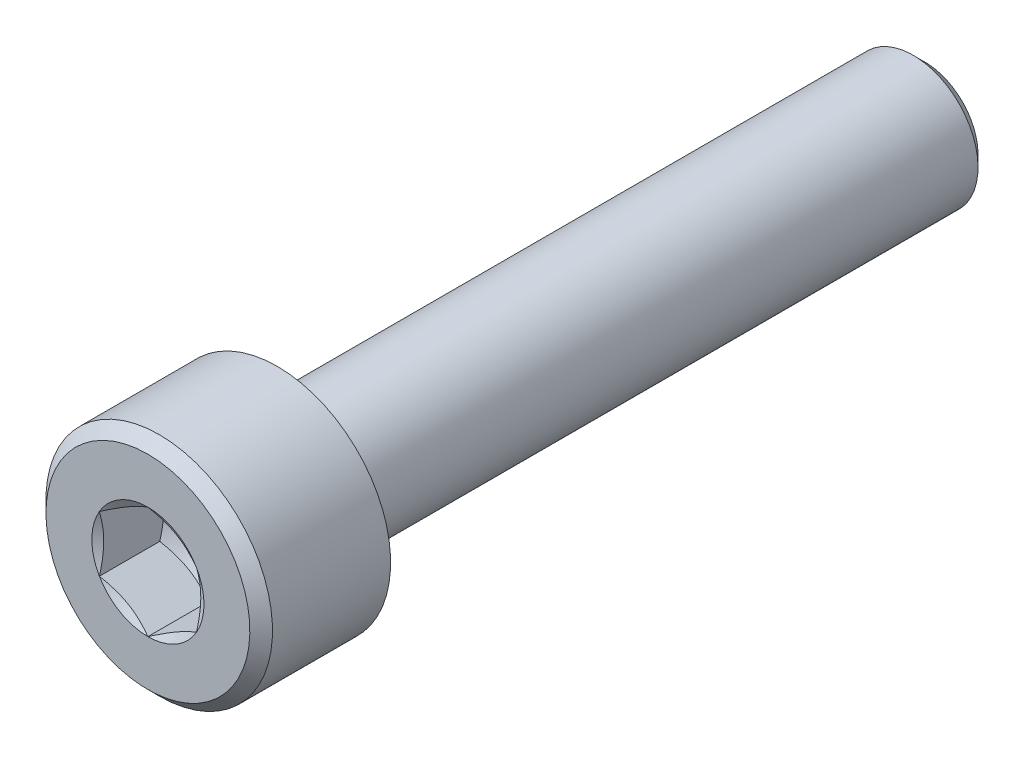
ISO-10303-21;
HEADER;
FILE_DESCRIPTION(('STEP AP214'),'2;1');
FILE_NAME('part.step','',(''),(''),'','','');
FILE_SCHEMA(('AUTOMOTIVE_DESIGN { 1 0 10303 214 1 1 1 1 }'));
ENDSEC;
DATA;
#1=APPLICATION_CONTEXT('core data for automotive mechanical design processes');
#2=APPLICATION_PROTOCOL_DEFINITION('international standard','automotive_design',2000,#1);
#3=PRODUCT_CONTEXT('',#1,'mechanical');
#4=PRODUCT('Part','Part','',(#3));
#5=PRODUCT_RELATED_PRODUCT_CATEGORY('part','',(#4));
#6=PRODUCT_DEFINITION_FORMATION('','',#4);
#7=PRODUCT_DEFINITION_CONTEXT('part definition',#1,'design');
#8=PRODUCT_DEFINITION('design','',#6,#7);
#9=PRODUCT_DEFINITION_SHAPE('','',#8);
#10=(LENGTH_UNIT() NAMED_UNIT(*) SI_UNIT(.MILLI.,.METRE.));
#11=(NAMED_UNIT(*) PLANE_ANGLE_UNIT() SI_UNIT($,.RADIAN.));
#12=(NAMED_UNIT(*) SI_UNIT($,.STERADIAN.) SOLID_ANGLE_UNIT());
#13=UNCERTAINTY_MEASURE_WITH_UNIT(LENGTH_MEASURE(1.E-05),#10,'distance_accuracy_value','');
#14=(GEOMETRIC_REPRESENTATION_CONTEXT(3) GLOBAL_UNCERTAINTY_ASSIGNED_CONTEXT((#13)) GLOBAL_UNIT_ASSIGNED_CONTEXT((#10,
#11,#12)) REPRESENTATION_CONTEXT('',''));
#15=CARTESIAN_POINT('',(0.,0.,0.));
#16=DIRECTION('',(0.,0.,1.));
#17=DIRECTION('',(1.,0.,0.));
#18=AXIS2_PLACEMENT_3D('',#15,#16,#17);
#19=CARTESIAN_POINT('',(0.,3.5,4.));
#20=DIRECTION('',(0.,0.,-1.));
#21=DIRECTION('',(0.,1.,0.));
#22=AXIS2_PLACEMENT_3D('',#19,#20,#21);
#23=PLANE('',#22);
#24=CARTESIAN_POINT('',(0.,0.,4.));
#25=DIRECTION('',(0.,0.,-1.));
#26=DIRECTION('',(0.,1.,0.));
#27=AXIS2_PLACEMENT_3D('',#24,#25,#26);
#28=CIRCLE('',#27,3.15);
#29=CARTESIAN_POINT('',(0.,3.15,4.));
#30=VERTEX_POINT('',#29);
#31=EDGE_CURVE('E287',#30,#30,#28,.F.);
#32=ORIENTED_EDGE('',*,*,#31,.T.);
#33=EDGE_LOOP('',(#32));
#34=FACE_BOUND('',#33,.T.);
#35=CARTESIAN_POINT('',(0.,0.,4.));
#36=DIRECTION('',(0.,0.,-1.));
#37=DIRECTION('',(0.,1.,0.));
#38=AXIS2_PLACEMENT_3D('',#35,#36,#37);
#39=CIRCLE('',#38,1.73205080756888);
#40=CARTESIAN_POINT('',(0.,1.73205080756888,4.));
#41=VERTEX_POINT('',#40);
#42=CARTESIAN_POINT('',(-1.5,0.866025403784438,4.));
#43=VERTEX_POINT('',#42);
#44=EDGE_CURVE('E109',#41,#43,#39,.F.);
#45=ORIENTED_EDGE('',*,*,#44,.F.);
#46=CARTESIAN_POINT('',(1.5,0.866025403784439,4.));
#47=VERTEX_POINT('',#46);
#48=EDGE_CURVE('E97',#47,#41,#39,.F.);
#49=ORIENTED_EDGE('',*,*,#48,.F.);
#50=CARTESIAN_POINT('',(1.5,-0.866025403784438,4.));
#51=VERTEX_POINT('',#50);
#52=EDGE_CURVE('E107',#51,#47,#39,.F.);
#53=ORIENTED_EDGE('',*,*,#52,.F.);
#54=CARTESIAN_POINT('',(0.,-1.73205080756888,4.));
#55=VERTEX_POINT('',#54);
#56=EDGE_CURVE('E459',#55,#51,#39,.F.);
#57=ORIENTED_EDGE('',*,*,#56,.F.);
#58=CARTESIAN_POINT('',(-1.5,-0.866025403785009,3.99999999999961));
#59=VERTEX_POINT('',#58);
#60=EDGE_CURVE('E139',#59,#55,#39,.F.);
#61=ORIENTED_EDGE('',*,*,#60,.F.);
#62=EDGE_CURVE('E140',#43,#59,#39,.F.);
#63=ORIENTED_EDGE('',*,*,#62,.F.);
#64=EDGE_LOOP('',(#45,#49,#53,#57,#61,#63));
#65=FACE_BOUND('',#64,.T.);
#66=ADVANCED_FACE('F43',(#34,#65),#23,.F.);
#67=CARTESIAN_POINT('',(0.,2.,0.));
#68=DIRECTION('',(0.,0.,1.));
#69=DIRECTION('',(0.,-1.,0.));
#70=AXIS2_PLACEMENT_3D('',#67,#68,#69);
#71=PLANE('',#70);
#72=CARTESIAN_POINT('',(0.,0.,0.));
#73=DIRECTION('',(0.,0.,1.));
#74=DIRECTION('',(0.,-1.,0.));
#75=AXIS2_PLACEMENT_3D('',#72,#73,#74);
#76=CIRCLE('',#75,2.4);
#77=CARTESIAN_POINT('',(0.,-2.4,0.));
#78=VERTEX_POINT('',#77);
#79=EDGE_CURVE('E51',#78,#78,#76,.T.);
#80=ORIENTED_EDGE('',*,*,#79,.T.);
#81=EDGE_LOOP('',(#80));
#82=FACE_BOUND('',#81,.T.);
#83=CARTESIAN_POINT('',(0.,0.,0.));
#84=DIRECTION('',(0.,0.,1.));
#85=DIRECTION('',(0.,-1.,0.));
#86=AXIS2_PLACEMENT_3D('',#83,#84,#85);
#87=CIRCLE('',#86,3.5);
#88=CARTESIAN_POINT('',(0.,-3.5,0.));
#89=VERTEX_POINT('',#88);
#90=EDGE_CURVE('E437',#89,#89,#87,.T.);
#91=ORIENTED_EDGE('',*,*,#90,.F.);
#92=EDGE_LOOP('',(#91));
#93=FACE_BOUND('',#92,.T.);
#94=ADVANCED_FACE('F249',(#82,#93),#71,.F.);
#95=CARTESIAN_POINT('',(0.,0.,4.));
#96=DIRECTION('',(0.,0.,1.));
#97=DIRECTION('',(0.,-1.,0.));
#98=AXIS2_PLACEMENT_3D('',#95,#96,#97);
#99=CYLINDRICAL_SURFACE('',#98,2.);
#100=CARTESIAN_POINT('',(0.,0.,-0.4));
#101=DIRECTION('',(0.,0.,1.));
#102=DIRECTION('',(0.,-1.,0.));
#103=AXIS2_PLACEMENT_3D('',#100,#101,#102);
#104=CIRCLE('',#103,2.);
#105=CARTESIAN_POINT('',(0.,-2.,-0.4));
#106=VERTEX_POINT('',#105);
#107=EDGE_CURVE('E12',#106,#106,#104,.F.);
#108=ORIENTED_EDGE('',*,*,#107,.T.);
#109=EDGE_LOOP('',(#108));
#110=FACE_BOUND('',#109,.T.);
#111=CARTESIAN_POINT('',(0.,0.,-19.65));
#112=DIRECTION('',(0.,0.,1.));
#113=DIRECTION('',(0.,-1.,0.));
#114=AXIS2_PLACEMENT_3D('',#111,#112,#113);
#115=CIRCLE('',#114,2.);
#116=CARTESIAN_POINT('',(0.,-2.,-19.65));
#117=VERTEX_POINT('',#116);
#118=EDGE_CURVE('E278',#117,#117,#115,.T.);
#119=ORIENTED_EDGE('',*,*,#118,.T.);
#120=EDGE_LOOP('',(#119));
#121=FACE_BOUND('',#120,.T.);
#122=ADVANCED_FACE('F255',(#110,#121),#99,.T.);
#123=CARTESIAN_POINT('',(0.,0.,-20.));
#124=DIRECTION('',(0.,0.,1.));
#125=DIRECTION('',(0.,-1.,0.));
#126=AXIS2_PLACEMENT_3D('',#123,#124,#125);
#127=PLANE('',#126);
#128=CARTESIAN_POINT('',(0.,0.,-20.));
#129=DIRECTION('',(0.,0.,1.));
#130=DIRECTION('',(0.,-1.,0.));
#131=AXIS2_PLACEMENT_3D('',#128,#129,#130);
#132=CIRCLE('',#131,1.65);
#133=CARTESIAN_POINT('',(0.,-1.65,-20.));
#134=VERTEX_POINT('',#133);
#135=EDGE_CURVE('E116',#134,#134,#132,.F.);
#136=ORIENTED_EDGE('',*,*,#135,.T.);
#137=EDGE_LOOP('',(#136));
#138=FACE_BOUND('',#137,.T.);
#139=ADVANCED_FACE('F259',(#138),#127,.F.);
#140=CARTESIAN_POINT('',(0.,0.,4.));
#141=DIRECTION('',(0.,0.,1.));
#142=DIRECTION('',(0.,-1.,0.));
#143=AXIS2_PLACEMENT_3D('',#140,#141,#142);
#144=CYLINDRICAL_SURFACE('',#143,3.5);
#145=CARTESIAN_POINT('',(0.,0.,3.65));
#146=DIRECTION('',(0.,0.,-1.));
#147=DIRECTION('',(0.,1.,0.));
#148=AXIS2_PLACEMENT_3D('',#145,#146,#147);
#149=CIRCLE('',#148,3.5);
#150=CARTESIAN_POINT('',(0.,3.5,3.65));
#151=VERTEX_POINT('',#150);
#152=EDGE_CURVE('E284',#151,#151,#149,.T.);
#153=ORIENTED_EDGE('',*,*,#152,.T.);
#154=EDGE_LOOP('',(#153));
#155=FACE_BOUND('',#154,.T.);
#156=ORIENTED_EDGE('',*,*,#90,.T.);
#157=EDGE_LOOP('',(#156));
#158=FACE_BOUND('',#157,.T.);
#159=ADVANCED_FACE('F174',(#155,#158),#144,.T.);
#160=CARTESIAN_POINT('',(0.,0.,4.));
#161=DIRECTION('',(0.,0.,-1.));
#162=DIRECTION('',(0.,1.,0.));
#163=AXIS2_PLACEMENT_3D('',#160,#161,#162);
#164=CONICAL_SURFACE('',#163,3.15,0.785398163397451);
#165=CARTESIAN_POINT('',(0.,3.5,3.65));
#166=CARTESIAN_POINT('',(0.,3.49635416666667,3.65364583333333));
#167=CARTESIAN_POINT('',(0.,3.49270833333333,3.65729166666667));
#168=CARTESIAN_POINT('',(0.,3.48541666666667,3.66458333333333));
#169=CARTESIAN_POINT('',(0.,3.48177083333333,3.66822916666667));
#170=CARTESIAN_POINT('',(0.,3.47447916666667,3.67552083333333));
#171=CARTESIAN_POINT('',(0.,3.47083333333333,3.67916666666667));
#172=CARTESIAN_POINT('',(0.,3.46354166666667,3.68645833333333));
#173=CARTESIAN_POINT('',(0.,3.45989583333333,3.69010416666667));
#174=CARTESIAN_POINT('',(0.,3.45260416666667,3.69739583333333));
#175=CARTESIAN_POINT('',(0.,3.44895833333333,3.70104166666667));
#176=CARTESIAN_POINT('',(0.,3.44166666666667,3.70833333333333));
#177=CARTESIAN_POINT('',(0.,3.43802083333333,3.71197916666667));
#178=CARTESIAN_POINT('',(0.,3.43072916666667,3.71927083333333));
#179=CARTESIAN_POINT('',(0.,3.42708333333333,3.72291666666667));
#180=CARTESIAN_POINT('',(0.,3.41979166666667,3.73020833333333));
#181=CARTESIAN_POINT('',(0.,3.41614583333333,3.73385416666667));
#182=CARTESIAN_POINT('',(0.,3.40885416666667,3.74114583333333));
#183=CARTESIAN_POINT('',(0.,3.40520833333333,3.74479166666667));
#184=CARTESIAN_POINT('',(0.,3.39791666666667,3.75208333333333));
#185=CARTESIAN_POINT('',(0.,3.39427083333333,3.75572916666667));
#186=CARTESIAN_POINT('',(0.,3.38697916666667,3.76302083333333));
#187=CARTESIAN_POINT('',(0.,3.38333333333333,3.76666666666667));
#188=CARTESIAN_POINT('',(0.,3.37604166666667,3.77395833333333));
#189=CARTESIAN_POINT('',(0.,3.37239583333333,3.77760416666667));
#190=CARTESIAN_POINT('',(0.,3.36510416666667,3.78489583333333));
#191=CARTESIAN_POINT('',(0.,3.36145833333333,3.78854166666667));
#192=CARTESIAN_POINT('',(0.,3.35416666666667,3.79583333333333));
#193=CARTESIAN_POINT('',(0.,3.35052083333333,3.79947916666667));
#194=CARTESIAN_POINT('',(0.,3.34322916666667,3.80677083333333));
#195=CARTESIAN_POINT('',(0.,3.33958333333333,3.81041666666667));
#196=CARTESIAN_POINT('',(0.,3.33229166666667,3.81770833333333));
#197=CARTESIAN_POINT('',(0.,3.32864583333333,3.82135416666667));
#198=CARTESIAN_POINT('',(0.,3.32135416666667,3.82864583333333));
#199=CARTESIAN_POINT('',(0.,3.31770833333333,3.83229166666667));
#200=CARTESIAN_POINT('',(0.,3.31041666666667,3.83958333333333));
#201=CARTESIAN_POINT('',(0.,3.30677083333333,3.84322916666667));
#202=CARTESIAN_POINT('',(0.,3.29947916666667,3.85052083333333));
#203=CARTESIAN_POINT('',(0.,3.29583333333333,3.85416666666667));
#204=CARTESIAN_POINT('',(0.,3.28854166666667,3.86145833333333));
#205=CARTESIAN_POINT('',(0.,3.28489583333333,3.86510416666667));
#206=CARTESIAN_POINT('',(0.,3.27760416666667,3.87239583333333));
#207=CARTESIAN_POINT('',(0.,3.27395833333333,3.87604166666667));
#208=CARTESIAN_POINT('',(0.,3.26666666666667,3.88333333333333));
#209=CARTESIAN_POINT('',(0.,3.26302083333333,3.88697916666667));
#210=CARTESIAN_POINT('',(0.,3.25572916666667,3.89427083333333));
#211=CARTESIAN_POINT('',(0.,3.25208333333333,3.89791666666667));
#212=CARTESIAN_POINT('',(0.,3.24479166666666,3.90520833333333));
#213=CARTESIAN_POINT('',(0.,3.24114583333333,3.90885416666667));
#214=CARTESIAN_POINT('',(0.,3.23385416666666,3.91614583333333));
#215=CARTESIAN_POINT('',(0.,3.23020833333333,3.91979166666667));
#216=CARTESIAN_POINT('',(0.,3.22291666666666,3.92708333333333));
#217=CARTESIAN_POINT('',(0.,3.21927083333333,3.93072916666667));
#218=CARTESIAN_POINT('',(0.,3.21197916666666,3.93802083333333));
#219=CARTESIAN_POINT('',(0.,3.20833333333333,3.94166666666667));
#220=CARTESIAN_POINT('',(0.,3.20104166666667,3.94895833333333));
#221=CARTESIAN_POINT('',(0.,3.19739583333333,3.95260416666667));
#222=CARTESIAN_POINT('',(0.,3.19010416666666,3.95989583333333));
#223=CARTESIAN_POINT('',(0.,3.18645833333333,3.96354166666667));
#224=CARTESIAN_POINT('',(0.,3.17916666666666,3.97083333333333));
#225=CARTESIAN_POINT('',(0.,3.17552083333333,3.97447916666667));
#226=CARTESIAN_POINT('',(0.,3.16822916666666,3.98177083333333));
#227=CARTESIAN_POINT('',(0.,3.16458333333333,3.98541666666667));
#228=CARTESIAN_POINT('',(0.,3.15729166666666,3.99270833333333));
#229=CARTESIAN_POINT('',(0.,3.15364583333333,3.99635416666667));
#230=CARTESIAN_POINT('',(0.,3.15,4.));
#231=B_SPLINE_CURVE_WITH_KNOTS('',3,(#165,#166,#167,#168,#169,#170,#171,#172,#173,#174,#175,
#176,#177,#178,#179,#180,#181,#182,#183,#184,#185,#186,#187,#188,#189,#190,#191,#192,#193,#194,
#195,#196,#197,#198,#199,#200,#201,#202,#203,#204,#205,#206,#207,#208,#209,#210,#211,#212,#213,
#214,#215,#216,#217,#218,#219,#220,#221,#222,#223,#224,#225,#226,#227,#228,#229,#230),
.UNSPECIFIED.,.F.,.F.,(4,2,2,2,2,2,2,2,2,2,2,2,2,2,2,2,2,2,2,2,2,2,2,2,2,2,2,2,2,2,2,2,4),(0.,
0.0154679608384559,0.0309359216769117,0.0464038825153676,0.0618718433538231,0.077339804192279,
0.0928077650307349,0.108275725869191,0.123743686707646,0.139211647546102,0.154679608384558,
0.170147569223013,0.185615530061469,0.201083490899925,0.216551451738381,0.232019412576836,
0.247487373415292,0.262955334253748,0.278423295092204,0.293891255930659,0.309359216769115,
0.324827177607571,0.340295138446027,0.355763099284482,0.371231060122938,0.386699020961394,
0.402166981799849,0.417634942638305,0.433102903476761,0.448570864315216,0.464038825153673,
0.479506785992128,0.494974746830584),.UNSPECIFIED.);
#232=EDGE_CURVE('BSEAM266',#151,#30,#231,.T.);
#233=ORIENTED_EDGE('',*,*,#152,.F.);
#234=ORIENTED_EDGE('',*,*,#31,.F.);
#235=ORIENTED_EDGE('',*,*,#232,.T.);
#236=ORIENTED_EDGE('',*,*,#232,.F.);
#237=EDGE_LOOP('',(#233,#235,#234,#236));
#238=FACE_BOUND('',#237,.T.);
#239=ADVANCED_FACE('F266',(#238),#164,.T.);
#240=CARTESIAN_POINT('',(0.,0.,-19.65));
#241=DIRECTION('',(0.,0.,1.));
#242=DIRECTION('',(0.,-1.,0.));
#243=AXIS2_PLACEMENT_3D('',#240,#241,#242);
#244=CONICAL_SURFACE('',#243,2.,0.785398163397453);
#245=ORIENTED_EDGE('',*,*,#135,.F.);
#246=EDGE_LOOP('',(#245));
#247=FACE_BOUND('',#246,.T.);
#248=ORIENTED_EDGE('',*,*,#118,.F.);
#249=EDGE_LOOP('',(#248));
#250=FACE_BOUND('',#249,.T.);
#251=ADVANCED_FACE('F268',(#247,#250),#244,.T.);
#252=CARTESIAN_POINT('',(0.,0.,3.86602540378444));
#253=DIRECTION('',(0.,0.,1.));
#254=DIRECTION('',(0.,-1.,0.));
#255=AXIS2_PLACEMENT_3D('',#252,#253,#254);
#256=CONICAL_SURFACE('',#255,1.5,1.04719755119659);
#257=ORIENTED_EDGE('',*,*,#44,.T.);
#258=CARTESIAN_POINT('',(-1.5002,0.865909933730601,4.00006667333289));
#259=CARTESIAN_POINT('',(-1.43428070889745,0.903968454193446,3.97808285655362));
#260=CARTESIAN_POINT('',(-1.36779241087776,0.942355490953072,3.95808888946626));
#261=CARTESIAN_POINT('',(-1.23366433933493,1.01979436916421,3.92318810096894));
#262=CARTESIAN_POINT('',(-1.16602218135311,1.05884758728358,3.9082936281076));
#263=CARTESIAN_POINT('',(-1.03157622213015,1.13646999803241,3.88510668109468));
#264=CARTESIAN_POINT('',(-0.96479311507275,1.17502724286933,3.87665991149625));
#265=CARTESIAN_POINT('',(-0.830912431610117,1.25232329150577,3.86657357729629));
#266=CARTESIAN_POINT('',(-0.763815342295619,1.29106181408333,3.86492566314233));
#267=CARTESIAN_POINT('',(-0.638425268170802,1.363455807133,3.86834162283754));
#268=CARTESIAN_POINT('',(-0.580113576780179,1.39712207785428,3.87256675900842));
#269=CARTESIAN_POINT('',(-0.463870120461216,1.46423526865157,3.88596177521711));
#270=CARTESIAN_POINT('',(-0.405938758031213,1.49768195634505,3.89513623740029));
#271=CARTESIAN_POINT('',(-0.289455348660846,1.56493368410116,3.91807318373943));
#272=CARTESIAN_POINT('',(-0.230918055453307,1.59873020609217,3.93193296194588));
#273=CARTESIAN_POINT('',(-0.114716876613639,1.6658189879754,3.96338978402109));
#274=CARTESIAN_POINT('',(-0.0570515005961885,1.699112108342,3.98097942967405));
#275=CARTESIAN_POINT('',(0.000200000000000599,1.73216627762272,4.00006667333289));
#276=B_SPLINE_CURVE_WITH_KNOTS('',3,(#258,#259,#260,#261,#262,#263,#264,#265,#266,#267,#268,
#269,#270,#271,#272,#273,#274,#275),.UNSPECIFIED.,.F.,.F.,(4,2,2,2,2,2,2,2,4),(0.,
0.237777822177383,0.47612742284192,0.708577067230591,0.940741159251582,1.14294352835891,
1.34533342091876,1.55221450553907,1.75868901573748),.UNSPECIFIED.);
#277=EDGE_CURVE('E111',#43,#41,#276,.T.);
#278=ORIENTED_EDGE('',*,*,#277,.T.);
#279=EDGE_LOOP('',(#257,#278));
#280=FACE_BOUND('',#279,.T.);
#281=ADVANCED_FACE('F113',(#280),#256,.F.);
#282=ORIENTED_EDGE('',*,*,#62,.T.);
#283=CARTESIAN_POINT('',(-1.5,-2.29682699623477,4.58381546174977));
#284=CARTESIAN_POINT('',(-1.5,-2.2309684314268,4.55198894696485));
#285=CARTESIAN_POINT('',(-1.5,-2.16495427911975,4.52047890103116));
#286=CARTESIAN_POINT('',(-1.5,-2.03253035916234,4.45827236301962));
#287=CARTESIAN_POINT('',(-1.5,-1.96612052542167,4.42757601179957));
#288=CARTESIAN_POINT('',(-1.5,-1.83246206085505,4.36701576872006));
#289=CARTESIAN_POINT('',(-1.5,-1.76521080472844,4.33715764593671));
#290=CARTESIAN_POINT('',(-1.5,-1.63015654639405,4.27872457930282));
#291=CARTESIAN_POINT('',(-1.5,-1.56235357316441,4.25014956856602));
#292=CARTESIAN_POINT('',(-1.5,-1.42524182236868,4.19428123175392));
#293=CARTESIAN_POINT('',(-1.5,-1.35592477698963,4.1670079399134));
#294=CARTESIAN_POINT('',(-1.5,-1.21648682560683,4.114607091517));
#295=CARTESIAN_POINT('',(-1.5,-1.14636582505602,4.08947979033248));
#296=CARTESIAN_POINT('',(-1.5,-0.93488848982257,4.01830655620188));
#297=CARTESIAN_POINT('',(-1.5,-0.792055645543787,3.97631519479002));
#298=CARTESIAN_POINT('',(-1.5,-0.574716861792489,3.92662686995573));
#299=CARTESIAN_POINT('',(-1.5,-0.501740163929646,3.91227894605775));
#300=CARTESIAN_POINT('',(-1.5,-0.354902578392891,3.88900178221446));
#301=CARTESIAN_POINT('',(-1.5,-0.281041689937303,3.88007254705994));
#302=CARTESIAN_POINT('',(-1.5,-0.133293538339916,3.86841949991762));
#303=CARTESIAN_POINT('',(-1.5,-0.0594094591844532,3.86565640265686));
#304=CARTESIAN_POINT('',(-1.5,0.0882997502193111,3.86647471759133));
#305=CARTESIAN_POINT('',(-1.5,0.16212489079173,3.87005448288011));
#306=CARTESIAN_POINT('',(-1.5,0.340722962115521,3.88606868097394));
#307=CARTESIAN_POINT('',(-1.5,0.445215370084735,3.9016376211551));
#308=CARTESIAN_POINT('',(-1.5,0.652266967956157,3.94267501352062));
#309=CARTESIAN_POINT('',(-1.5,0.75482373395318,3.96815511283851));
#310=CARTESIAN_POINT('',(-1.5,0.908315300733135,4.0120946140706));
#311=CARTESIAN_POINT('',(-1.5,0.960034914221896,4.02791828683993));
#312=CARTESIAN_POINT('',(-1.5,1.06293144318351,4.0611319665997));
#313=CARTESIAN_POINT('',(-1.5,1.11410870613225,4.07852089324017));
#314=CARTESIAN_POINT('',(-1.5,1.21571016200016,4.11450258484297));
#315=CARTESIAN_POINT('',(-1.5,1.26613697230808,4.13308802287939));
#316=CARTESIAN_POINT('',(-1.5,1.36659934936444,4.17134976450949));
#317=CARTESIAN_POINT('',(-1.5,1.41663474852877,4.19102650899392));
#318=CARTESIAN_POINT('',(-1.5,1.46648887119986,4.21114128123753));
#319=B_SPLINE_CURVE_WITH_KNOTS('',3,(#283,#284,#285,#286,#287,#288,#289,#290,#291,#292,#293,
#294,#295,#296,#297,#298,#299,#300,#301,#302,#303,#304,#305,#306,#307,#308,#309,#310,#311,#312,
#313,#314,#315,#316,#317,#318),.UNSPECIFIED.,.F.,.F.,(4,2,2,2,2,2,2,2,2,2,2,2,2,2,2,2,2,4),(0.,
0.219439422199607,0.438916586474737,0.659649729922478,0.880371353568122,1.10380188972073,
1.32725897700685,1.77299403244385,1.99595442873026,2.21891502214139,2.44045099917849,
2.66192946345043,2.97821851269849,3.29488037855718,3.45711959307414,3.6192476751439,
3.78046319144391,3.94174432052952),.UNSPECIFIED.);
#320=EDGE_CURVE('E226',#59,#43,#319,.T.);
#321=ORIENTED_EDGE('',*,*,#320,.T.);
#322=EDGE_LOOP('',(#282,#321));
#323=FACE_BOUND('',#322,.T.);
#324=ADVANCED_FACE('F273',(#323),#256,.F.);
#325=ORIENTED_EDGE('',*,*,#60,.T.);
#326=CARTESIAN_POINT('',(0.000200000000001564,-1.73216627762271,4.00006667333289));
#327=CARTESIAN_POINT('',(-0.0657192911025461,-1.69410775715987,3.97808285655362));
#328=CARTESIAN_POINT('',(-0.132207589122234,-1.65572072040024,3.95808888946626));
#329=CARTESIAN_POINT('',(-0.266335660665069,-1.5782818421891,3.92318810096894));
#330=CARTESIAN_POINT('',(-0.333977818646885,-1.53922862406973,3.9082936281076));
#331=CARTESIAN_POINT('',(-0.468423777869842,-1.4616062133209,3.88510668109468));
#332=CARTESIAN_POINT('',(-0.535206884927247,-1.42304896848399,3.87665991149625));
#333=CARTESIAN_POINT('',(-0.66908756838988,-1.34575291984755,3.86657357729629));
#334=CARTESIAN_POINT('',(-0.736184657704378,-1.30701439726998,3.86492566314233));
#335=CARTESIAN_POINT('',(-0.861574731829195,-1.23462040422031,3.86834162283754));
#336=CARTESIAN_POINT('',(-0.919886423219819,-1.20095413349903,3.87256675900842));
#337=CARTESIAN_POINT('',(-1.03612987953878,-1.13384094270174,3.88596177521711));
#338=CARTESIAN_POINT('',(-1.09406124196878,-1.10039425500826,3.89513623740028));
#339=CARTESIAN_POINT('',(-1.21054465133915,-1.03314252725215,3.91807318373943));
#340=CARTESIAN_POINT('',(-1.26908194454669,-0.99934600526115,3.93193296194588));
#341=CARTESIAN_POINT('',(-1.38528312338636,-0.932257223377916,3.96338978402109));
#342=CARTESIAN_POINT('',(-1.44294849940381,-0.89896410301132,3.98097942967405));
#343=CARTESIAN_POINT('',(-1.5002,-0.8659099337306,4.00006667333289));
#344=B_SPLINE_CURVE_WITH_KNOTS('',3,(#326,#327,#328,#329,#330,#331,#332,#333,#334,#335,#336,
#337,#338,#339,#340,#341,#342,#343),.UNSPECIFIED.,.F.,.F.,(4,2,2,2,2,2,2,2,4),(0.,
0.237777822177384,0.47612742284192,0.708577067230591,0.940741159251582,1.14294352835891,
1.34533342091876,1.55221450553907,1.75868901573748),.UNSPECIFIED.);
#345=EDGE_CURVE('E221',#55,#59,#344,.T.);
#346=ORIENTED_EDGE('',*,*,#345,.T.);
#347=EDGE_LOOP('',(#325,#346));
#348=FACE_BOUND('',#347,.T.);
#349=ADVANCED_FACE('F353',(#348),#256,.F.);
#350=ORIENTED_EDGE('',*,*,#56,.T.);
#351=CARTESIAN_POINT('',(1.5002,-0.8659099337306,4.00006667333289));
#352=CARTESIAN_POINT('',(1.43428070889745,-0.903968454193445,3.97808285655362));
#353=CARTESIAN_POINT('',(1.36779241087776,-0.942355490953071,3.95808888946626));
#354=CARTESIAN_POINT('',(1.23366433933493,-1.01979436916421,3.92318810096894));
#355=CARTESIAN_POINT('',(1.16602218135311,-1.05884758728358,3.9082936281076));
#356=CARTESIAN_POINT('',(1.03157622213015,-1.13646999803241,3.88510668109468));
#357=CARTESIAN_POINT('',(0.96479311507275,-1.17502724286933,3.87665991149625));
#358=CARTESIAN_POINT('',(0.830912431610117,-1.25232329150577,3.86657357729629));
#359=CARTESIAN_POINT('',(0.763815342295619,-1.29106181408333,3.86492566314233));
#360=CARTESIAN_POINT('',(0.638425268170802,-1.363455807133,3.86834162283754));
#361=CARTESIAN_POINT('',(0.580113576780179,-1.39712207785428,3.87256675900842));
#362=CARTESIAN_POINT('',(0.463870120461216,-1.46423526865157,3.88596177521711));
#363=CARTESIAN_POINT('',(0.405938758031213,-1.49768195634505,3.89513623740029));
#364=CARTESIAN_POINT('',(0.289455348660848,-1.56493368410116,3.91807318373943));
#365=CARTESIAN_POINT('',(0.230918055453308,-1.59873020609216,3.93193296194588));
#366=CARTESIAN_POINT('',(0.11471687661364,-1.6658189879754,3.96338978402109));
#367=CARTESIAN_POINT('',(0.05705150059619,-1.69911210834199,3.98097942967405));
#368=CARTESIAN_POINT('',(-0.000199999999999121,-1.73216627762271,4.00006667333289));
#369=B_SPLINE_CURVE_WITH_KNOTS('',3,(#351,#352,#353,#354,#355,#356,#357,#358,#359,#360,#361,
#362,#363,#364,#365,#366,#367,#368),.UNSPECIFIED.,.F.,.F.,(4,2,2,2,2,2,2,2,4),(0.,
0.237777822177384,0.47612742284192,0.708577067230591,0.940741159251582,1.14294352835891,
1.34533342091875,1.55221450553907,1.75868901573748),.UNSPECIFIED.);
#370=EDGE_CURVE('E62',#51,#55,#369,.T.);
#371=ORIENTED_EDGE('',*,*,#370,.T.);
#372=EDGE_LOOP('',(#350,#371));
#373=FACE_BOUND('',#372,.T.);
#374=ADVANCED_FACE('F358',(#373),#256,.F.);
#375=ORIENTED_EDGE('',*,*,#52,.T.);
#376=CARTESIAN_POINT('',(1.5,-2.29682699623459,4.58381546174968));
#377=CARTESIAN_POINT('',(1.5,-2.23096843142662,4.55198894696476));
#378=CARTESIAN_POINT('',(1.5,-2.16495427911957,4.52047890103107));
#379=CARTESIAN_POINT('',(1.5,-2.03253035916217,4.45827236301954));
#380=CARTESIAN_POINT('',(1.5,-1.9661205254215,4.42757601179949));
#381=CARTESIAN_POINT('',(1.5,-1.83246206085488,4.36701576871999));
#382=CARTESIAN_POINT('',(1.5,-1.76521080472827,4.33715764593663));
#383=CARTESIAN_POINT('',(1.5,-1.63015654639388,4.27872457930275));
#384=CARTESIAN_POINT('',(1.5,-1.56235357316424,4.25014956856595));
#385=CARTESIAN_POINT('',(1.5,-1.42524182236852,4.19428123175386));
#386=CARTESIAN_POINT('',(1.5,-1.35592477698947,4.16700793991334));
#387=CARTESIAN_POINT('',(1.5,-1.21648682560668,4.11460709151695));
#388=CARTESIAN_POINT('',(1.5,-1.14636582505587,4.08947979033242));
#389=CARTESIAN_POINT('',(1.5,-0.93488848982242,4.01830655620183));
#390=CARTESIAN_POINT('',(1.5,-0.792055645543641,3.97631519478998));
#391=CARTESIAN_POINT('',(1.5,-0.574716861792349,3.9266268699557));
#392=CARTESIAN_POINT('',(1.5,-0.501740163929508,3.91227894605772));
#393=CARTESIAN_POINT('',(1.5,-0.354902578392757,3.88900178221444));
#394=CARTESIAN_POINT('',(1.5,-0.281041689937171,3.88007254705993));
#395=CARTESIAN_POINT('',(1.5,-0.133293538339789,3.86841949991761));
#396=CARTESIAN_POINT('',(1.5,-0.0594094591843288,3.86565640265686));
#397=CARTESIAN_POINT('',(1.5,0.0882997502194307,3.86647471759134));
#398=CARTESIAN_POINT('',(1.5,0.162124890791847,3.87005448288012));
#399=CARTESIAN_POINT('',(1.5,0.340722962115643,3.88606868097395));
#400=CARTESIAN_POINT('',(1.5,0.445215370084865,3.90163762115512));
#401=CARTESIAN_POINT('',(1.5,0.652266967956301,3.94267501352065));
#402=CARTESIAN_POINT('',(1.5,0.754823733953331,3.96815511283855));
#403=CARTESIAN_POINT('',(1.5,0.908315300733296,4.01209461407064));
#404=CARTESIAN_POINT('',(1.5,0.960034914222061,4.02791828683998));
#405=CARTESIAN_POINT('',(1.5,1.06293144318368,4.06113196659975));
#406=CARTESIAN_POINT('',(1.5,1.11410870613243,4.07852089324023));
#407=CARTESIAN_POINT('',(1.5,1.21571016200034,4.11450258484304));
#408=CARTESIAN_POINT('',(1.5,1.26613697230826,4.13308802287946));
#409=CARTESIAN_POINT('',(1.5,1.36659934936462,4.17134976450956));
#410=CARTESIAN_POINT('',(1.5,1.41663474852896,4.19102650899399));
#411=CARTESIAN_POINT('',(1.5,1.46648887120005,4.21114128123761));
#412=B_SPLINE_CURVE_WITH_KNOTS('',3,(#376,#377,#378,#379,#380,#381,#382,#383,#384,#385,#386,
#387,#388,#389,#390,#391,#392,#393,#394,#395,#396,#397,#398,#399,#400,#401,#402,#403,#404,#405,
#406,#407,#408,#409,#410,#411),.UNSPECIFIED.,.F.,.F.,(4,2,2,2,2,2,2,2,2,2,2,2,2,2,2,2,2,4),(0.,
0.219439422199601,0.438916586474725,0.659649729922461,0.8803713535681,1.1038018897207,
1.32725897700681,1.77299403244379,1.99595442873019,2.21891502214132,2.44045099917841,
2.66192946345035,2.97821851269843,3.29488037855714,3.45711959307411,3.61924767514389,
3.78046319144391,3.94174432052953),.UNSPECIFIED.);
#413=EDGE_CURVE('E60',#47,#51,#412,.F.);
#414=ORIENTED_EDGE('',*,*,#413,.T.);
#415=EDGE_LOOP('',(#375,#414));
#416=FACE_BOUND('',#415,.T.);
#417=ADVANCED_FACE('F369',(#416),#256,.F.);
#418=ORIENTED_EDGE('',*,*,#48,.T.);
#419=CARTESIAN_POINT('',(-0.000200000000000005,1.73216627762271,4.00006667333289));
#420=CARTESIAN_POINT('',(0.0657192911025477,1.69410775715987,3.97808285655362));
#421=CARTESIAN_POINT('',(0.132207589122235,1.65572072040024,3.95808888946626));
#422=CARTESIAN_POINT('',(0.266335660665071,1.5782818421891,3.92318810096894));
#423=CARTESIAN_POINT('',(0.333977818646886,1.53922862406973,3.9082936281076));
#424=CARTESIAN_POINT('',(0.468423777869844,1.4616062133209,3.88510668109468));
#425=CARTESIAN_POINT('',(0.535206884927248,1.42304896848399,3.87665991149625));
#426=CARTESIAN_POINT('',(0.669087568389881,1.34575291984755,3.86657357729629));
#427=CARTESIAN_POINT('',(0.736184657704379,1.30701439726998,3.86492566314233));
#428=CARTESIAN_POINT('',(0.861574731829196,1.23462040422031,3.86834162283754));
#429=CARTESIAN_POINT('',(0.91988642321982,1.20095413349903,3.87256675900842));
#430=CARTESIAN_POINT('',(1.03612987953878,1.13384094270175,3.88596177521711));
#431=CARTESIAN_POINT('',(1.09406124196879,1.10039425500826,3.89513623740029));
#432=CARTESIAN_POINT('',(1.21054465133915,1.03314252725216,3.91807318373943));
#433=CARTESIAN_POINT('',(1.26908194454669,0.999346005261151,3.93193296194588));
#434=CARTESIAN_POINT('',(1.38528312338636,0.932257223377917,3.96338978402109));
#435=CARTESIAN_POINT('',(1.44294849940381,0.898964103011321,3.98097942967405));
#436=CARTESIAN_POINT('',(1.5002,0.865909933730601,4.00006667333289));
#437=B_SPLINE_CURVE_WITH_KNOTS('',3,(#419,#420,#421,#422,#423,#424,#425,#426,#427,#428,#429,
#430,#431,#432,#433,#434,#435,#436),.UNSPECIFIED.,.F.,.F.,(4,2,2,2,2,2,2,2,4),(0.,
0.237777822177384,0.47612742284192,0.708577067230591,0.940741159251582,1.1429435283589,
1.34533342091875,1.55221450553907,1.75868901573748),.UNSPECIFIED.);
#438=EDGE_CURVE('E103',#41,#47,#437,.T.);
#439=ORIENTED_EDGE('',*,*,#438,.T.);
#440=EDGE_LOOP('',(#418,#439));
#441=FACE_BOUND('',#440,.T.);
#442=ADVANCED_FACE('F101',(#441),#256,.F.);
#443=CARTESIAN_POINT('',(0.,0.,1.13397459621557));
#444=DIRECTION('',(0.,0.,1.));
#445=DIRECTION('',(1.,0.,0.));
#446=AXIS2_PLACEMENT_3D('',#443,#444,#445);
#447=CONICAL_SURFACE('',#446,0.,1.0471975511966);
#448=CARTESIAN_POINT('',(1.5002,-0.8659099337306,2.13404126954845));
#449=CARTESIAN_POINT('',(1.43428070889745,-0.903968454193445,2.11205745276918));
#450=CARTESIAN_POINT('',(1.36779241087776,-0.942355490953072,2.09206348568182));
#451=CARTESIAN_POINT('',(1.23366433933493,-1.01979436916421,2.05716269718451));
#452=CARTESIAN_POINT('',(1.16602218135311,-1.05884758728358,2.04226822432317));
#453=CARTESIAN_POINT('',(1.03157622213016,-1.13646999803241,2.01908127731024));
#454=CARTESIAN_POINT('',(0.964793115072751,-1.17502724286932,2.01063450771181));
#455=CARTESIAN_POINT('',(0.830912431610118,-1.25232329150577,2.00054817351185));
#456=CARTESIAN_POINT('',(0.763815342295621,-1.29106181408333,1.99890025935789));
#457=CARTESIAN_POINT('',(0.638425268170804,-1.363455807133,2.0023162190531));
#458=CARTESIAN_POINT('',(0.58011357678018,-1.39712207785428,2.00654135522398));
#459=CARTESIAN_POINT('',(0.463870120461217,-1.46423526865157,2.01993637143267));
#460=CARTESIAN_POINT('',(0.405938758031214,-1.49768195634505,2.02911083361585));
#461=CARTESIAN_POINT('',(0.289455348660848,-1.56493368410116,2.05204777995499));
#462=CARTESIAN_POINT('',(0.230918055453308,-1.59873020609216,2.06590755816145));
#463=CARTESIAN_POINT('',(0.114716876613641,-1.6658189879754,2.09736438023666));
#464=CARTESIAN_POINT('',(0.0570515005961902,-1.69911210834199,2.11495402588961));
#465=CARTESIAN_POINT('',(-0.000199999999999149,-1.73216627762271,2.13404126954845));
#466=B_SPLINE_CURVE_WITH_KNOTS('',3,(#448,#449,#450,#451,#452,#453,#454,#455,#456,#457,#458,
#459,#460,#461,#462,#463,#464,#465),.UNSPECIFIED.,.F.,.F.,(4,2,2,2,2,2,2,2,4),(0.,
0.237777822177383,0.476127422841918,0.708577067230589,0.940741159251579,1.1429435283589,
1.34533342091875,1.55221450553907,1.75868901573748),.UNSPECIFIED.);
#467=CARTESIAN_POINT('',(1.5,-0.866025403784437,2.13397459621556));
#468=VERTEX_POINT('',#467);
#469=CARTESIAN_POINT('',(0.,-1.73205080756888,2.13397459621556));
#470=VERTEX_POINT('',#469);
#471=EDGE_CURVE('E188',#468,#470,#466,.T.);
#472=ORIENTED_EDGE('',*,*,#471,.F.);
#473=CARTESIAN_POINT('',(1.5,-2.33638172143764,2.73695926533209));
#474=CARTESIAN_POINT('',(1.5,-2.27073746308518,2.7050753029045));
#475=CARTESIAN_POINT('',(1.5,-2.20494350519924,2.67349431533468));
#476=CARTESIAN_POINT('',(1.5,-2.07297652920601,2.61110864204666));
#477=CARTESIAN_POINT('',(1.5,-2.00680345405086,2.5803040771383));
#478=CARTESIAN_POINT('',(1.5,-1.87366303850479,2.51948904923768));
#479=CARTESIAN_POINT('',(1.5,-1.80669334205265,2.48948372664897));
#480=CARTESIAN_POINT('',(1.5,-1.67222431218375,2.43068893832524));
#481=CARTESIAN_POINT('',(1.5,-1.60472500380379,2.40189941552045));
#482=CARTESIAN_POINT('',(1.5,-1.46696329677769,2.34497876084356));
#483=CARTESIAN_POINT('',(1.5,-1.39668058797474,2.31689651901963));
#484=CARTESIAN_POINT('',(1.5,-1.25529643583992,2.26283280528536));
#485=CARTESIAN_POINT('',(1.5,-1.1841948966034,2.23685158237307));
#486=CARTESIAN_POINT('',(1.5,-1.04119289890137,2.18766516265908));
#487=CARTESIAN_POINT('',(1.5,-0.969294394048635,2.16445434256171));
#488=CARTESIAN_POINT('',(1.5,-0.824460957139506,2.12154326840006));
#489=CARTESIAN_POINT('',(1.5,-0.751526270024591,2.10184219910388));
#490=CARTESIAN_POINT('',(1.5,-0.604949278656588,2.06698624064826));
#491=CARTESIAN_POINT('',(1.5,-0.531312432701283,2.05180882108513));
#492=CARTESIAN_POINT('',(1.5,-0.383114146421021,2.0268654530333));
#493=CARTESIAN_POINT('',(1.5,-0.308552812224901,2.0170988891664));
#494=CARTESIAN_POINT('',(1.5,-0.159849207097553,2.00388569293512));
#495=CARTESIAN_POINT('',(1.5,-0.0857144150481243,2.00035726510114));
#496=CARTESIAN_POINT('',(1.5,0.062584809705341,1.9996942124006));
#497=CARTESIAN_POINT('',(1.5,0.136749243779921,2.00255992871794));
#498=CARTESIAN_POINT('',(1.5,0.313926943374791,2.0167964444896));
#499=CARTESIAN_POINT('',(1.5,0.416706236041581,2.03109167954821));
#500=CARTESIAN_POINT('',(1.5,0.6204409385975,2.06949441866168));
#501=CARTESIAN_POINT('',(1.5,0.721394212224155,2.09361272576563));
#502=CARTESIAN_POINT('',(1.5,0.872531413665916,2.13552332374344));
#503=CARTESIAN_POINT('',(1.5,0.923479443111308,2.15066992536833));
#504=CARTESIAN_POINT('',(1.5,1.0248466020618,2.18254554361804));
#505=CARTESIAN_POINT('',(1.5,1.07526602699258,2.1992736175561));
#506=CARTESIAN_POINT('',(1.5,1.17563999590392,2.234052980315));
#507=CARTESIAN_POINT('',(1.5,1.22559456397177,2.25210420013978));
#508=CARTESIAN_POINT('',(1.5,1.32509493865062,2.28931641567659));
#509=CARTESIAN_POINT('',(1.5,1.37464068765685,2.30847756483279));
#510=CARTESIAN_POINT('',(1.5,1.54079899785297,2.37451828969188));
#511=CARTESIAN_POINT('',(1.5,1.65657296027723,2.42350677015839));
#512=CARTESIAN_POINT('',(1.5,1.88662968507772,2.52488299526389));
#513=CARTESIAN_POINT('',(1.5,2.00091210483445,2.57727150496717));
#514=CARTESIAN_POINT('',(1.5,2.22843594400163,2.68441475667999));
#515=CARTESIAN_POINT('',(1.5,2.34167674818017,2.73917080030635));
#516=CARTESIAN_POINT('',(1.5,2.56734049143798,2.85034680982492));
#517=CARTESIAN_POINT('',(1.5,2.6797633958415,2.9067668457573));
#518=CARTESIAN_POINT('',(1.5,3.01663743013597,3.07808122801432));
#519=CARTESIAN_POINT('',(1.5,3.24017029546002,3.19477748976176));
#520=CARTESIAN_POINT('',(1.5,3.68570645508727,3.43083807548357));
#521=CARTESIAN_POINT('',(1.5,3.9077102757758,3.55020141435472));
#522=CARTESIAN_POINT('',(1.5,4.31835016351924,3.77304008568826));
#523=CARTESIAN_POINT('',(1.5,4.50711258178504,3.87628281803173));
#524=CARTESIAN_POINT('',(1.5,4.88417484270958,4.08365722384593));
#525=CARTESIAN_POINT('',(1.5,5.07247463211529,4.18778899399817));
#526=CARTESIAN_POINT('',(1.5,5.44792415818001,4.39624523956025));
#527=CARTESIAN_POINT('',(1.5,5.63507538726964,4.50056702919965));
#528=CARTESIAN_POINT('',(1.5,6.00908589642712,4.70967986122868));
#529=CARTESIAN_POINT('',(1.5,6.19594520904585,4.81447084538124));
#530=CARTESIAN_POINT('',(1.5,6.38271019777031,4.9194287507709));
#531=B_SPLINE_CURVE_WITH_KNOTS('',3,(#473,#474,#475,#476,#477,#478,#479,#480,#481,#482,#483,
#484,#485,#486,#487,#488,#489,#490,#491,#492,#493,#494,#495,#496,#497,#498,#499,#500,#501,#502,
#503,#504,#505,#506,#507,#508,#509,#510,#511,#512,#513,#514,#515,#516,#517,#518,#519,#520,#521,
#522,#523,#524,#525,#526,#527,#528,#529,#530),.UNSPECIFIED.,.F.,.F.,(4,2,2,2,2,2,2,2,2,2,2,2,2,
2,2,2,2,2,2,2,2,2,2,2,2,2,2,2,4),(0.,0.218935960780117,0.437905779857497,0.658049085221717,
0.878182045526497,1.10521210761684,1.33226903640778,1.55885695723178,1.78539217823662,
2.01077950755234,2.23614119823667,2.45852535984716,2.68092138789513,2.9915936559066,
3.30260851627753,3.4620442461608,3.62138553143838,3.78071851369412,3.94007357603886,
4.3171115656507,4.69423469134877,5.07156785484017,5.44891692363528,6.20535831057315,
6.96152477413694,7.6069767822923,8.25249989987042,8.89528800376651,9.53799842113576),.UNSPECIFIED.);
#532=CARTESIAN_POINT('',(1.5,0.86602540378444,2.13397459621556));
#533=VERTEX_POINT('',#532);
#534=EDGE_CURVE('E194',#533,#468,#531,.F.);
#535=ORIENTED_EDGE('',*,*,#534,.F.);
#536=CARTESIAN_POINT('',(-0.000200000000000005,1.73216627762271,2.13404126954845));
#537=CARTESIAN_POINT('',(0.0657192911025476,1.69410775715987,2.11205745276918));
#538=CARTESIAN_POINT('',(0.132207589122235,1.65572072040024,2.09206348568182));
#539=CARTESIAN_POINT('',(0.26633566066507,1.5782818421891,2.05716269718451));
#540=CARTESIAN_POINT('',(0.333977818646886,1.53922862406973,2.04226822432317));
#541=CARTESIAN_POINT('',(0.468423777869843,1.4616062133209,2.01908127731024));
#542=CARTESIAN_POINT('',(0.535206884927248,1.42304896848399,2.01063450771182));
#543=CARTESIAN_POINT('',(0.66908756838988,1.34575291984755,2.00054817351185));
#544=CARTESIAN_POINT('',(0.736184657704378,1.30701439726998,1.99890025935789));
#545=CARTESIAN_POINT('',(0.861574731829195,1.23462040422031,2.0023162190531));
#546=CARTESIAN_POINT('',(0.919886423219819,1.20095413349903,2.00654135522398));
#547=CARTESIAN_POINT('',(1.03612987953878,1.13384094270175,2.01993637143267));
#548=CARTESIAN_POINT('',(1.09406124196878,1.10039425500826,2.02911083361585));
#549=CARTESIAN_POINT('',(1.21054465133915,1.03314252725216,2.052047779955));
#550=CARTESIAN_POINT('',(1.26908194454669,0.999346005261151,2.06590755816145));
#551=CARTESIAN_POINT('',(1.38528312338636,0.932257223377917,2.09736438023666));
#552=CARTESIAN_POINT('',(1.44294849940381,0.898964103011321,2.11495402588961));
#553=CARTESIAN_POINT('',(1.5002,0.865909933730601,2.13404126954845));
#554=B_SPLINE_CURVE_WITH_KNOTS('',3,(#536,#537,#538,#539,#540,#541,#542,#543,#544,#545,#546,
#547,#548,#549,#550,#551,#552,#553),.UNSPECIFIED.,.F.,.F.,(4,2,2,2,2,2,2,2,4),(0.,
0.237777822177383,0.476127422841919,0.70857706723059,0.94074115925158,1.1429435283589,
1.34533342091875,1.55221450553907,1.75868901573748),.UNSPECIFIED.);
#555=CARTESIAN_POINT('',(0.,1.73205080756888,2.13397459621556));
#556=VERTEX_POINT('',#555);
#557=EDGE_CURVE('E199',#556,#533,#554,.T.);
#558=ORIENTED_EDGE('',*,*,#557,.F.);
#559=CARTESIAN_POINT('',(-1.5002,0.865909933730601,2.13404126954845));
#560=CARTESIAN_POINT('',(-1.43428070889745,0.903968454193446,2.11205745276918));
#561=CARTESIAN_POINT('',(-1.36779241087776,0.942355490953072,2.09206348568182));
#562=CARTESIAN_POINT('',(-1.23366433933493,1.01979436916421,2.05716269718451));
#563=CARTESIAN_POINT('',(-1.16602218135311,1.05884758728358,2.04226822432317));
#564=CARTESIAN_POINT('',(-1.03157622213016,1.13646999803241,2.01908127731024));
#565=CARTESIAN_POINT('',(-0.964793115072751,1.17502724286933,2.01063450771182));
#566=CARTESIAN_POINT('',(-0.830912431610119,1.25232329150577,2.00054817351185));
#567=CARTESIAN_POINT('',(-0.763815342295621,1.29106181408333,1.99890025935789));
#568=CARTESIAN_POINT('',(-0.638425268170804,1.363455807133,2.0023162190531));
#569=CARTESIAN_POINT('',(-0.58011357678018,1.39712207785428,2.00654135522398));
#570=CARTESIAN_POINT('',(-0.463870120461217,1.46423526865157,2.01993637143267));
#571=CARTESIAN_POINT('',(-0.405938758031214,1.49768195634505,2.02911083361585));
#572=CARTESIAN_POINT('',(-0.289455348660848,1.56493368410116,2.052047779955));
#573=CARTESIAN_POINT('',(-0.230918055453308,1.59873020609216,2.06590755816145));
#574=CARTESIAN_POINT('',(-0.11471687661364,1.6658189879754,2.09736438023666));
#575=CARTESIAN_POINT('',(-0.0570515005961894,1.69911210834199,2.11495402588962));
#576=CARTESIAN_POINT('',(0.000199999999999936,1.73216627762271,2.13404126954845));
#577=B_SPLINE_CURVE_WITH_KNOTS('',3,(#559,#560,#561,#562,#563,#564,#565,#566,#567,#568,#569,
#570,#571,#572,#573,#574,#575,#576),.UNSPECIFIED.,.F.,.F.,(4,2,2,2,2,2,2,2,4),(0.,
0.237777822177383,0.476127422841918,0.708577067230589,0.940741159251579,1.1429435283589,
1.34533342091875,1.55221450553907,1.75868901573748),.UNSPECIFIED.);
#578=CARTESIAN_POINT('',(-1.5,0.866025403784439,2.13397459621556));
#579=VERTEX_POINT('',#578);
#580=EDGE_CURVE('E133',#579,#556,#577,.T.);
#581=ORIENTED_EDGE('',*,*,#580,.F.);
#582=CARTESIAN_POINT('',(-1.5,-2.33638172143764,2.73695926533209));
#583=CARTESIAN_POINT('',(-1.5,-2.27073746308518,2.7050753029045));
#584=CARTESIAN_POINT('',(-1.5,-2.20494350519924,2.67349431533468));
#585=CARTESIAN_POINT('',(-1.5,-2.07297652920601,2.61110864204665));
#586=CARTESIAN_POINT('',(-1.5,-2.00680345405086,2.5803040771383));
#587=CARTESIAN_POINT('',(-1.5,-1.87366303850479,2.51948904923768));
#588=CARTESIAN_POINT('',(-1.5,-1.80669334205264,2.48948372664897));
#589=CARTESIAN_POINT('',(-1.5,-1.67222431218375,2.43068893832524));
#590=CARTESIAN_POINT('',(-1.5,-1.60472500380379,2.40189941552045));
#591=CARTESIAN_POINT('',(-1.5,-1.46696329677769,2.34497876084356));
#592=CARTESIAN_POINT('',(-1.5,-1.39668058797474,2.31689651901963));
#593=CARTESIAN_POINT('',(-1.5,-1.25529643583992,2.26283280528536));
#594=CARTESIAN_POINT('',(-1.5,-1.1841948966034,2.23685158237307));
#595=CARTESIAN_POINT('',(-1.5,-1.04119289890137,2.18766516265908));
#596=CARTESIAN_POINT('',(-1.5,-0.969294394048635,2.16445434256171));
#597=CARTESIAN_POINT('',(-1.5,-0.824460957139505,2.12154326840006));
#598=CARTESIAN_POINT('',(-1.5,-0.75152627002459,2.10184219910388));
#599=CARTESIAN_POINT('',(-1.5,-0.604949278656587,2.06698624064826));
#600=CARTESIAN_POINT('',(-1.5,-0.531312432701283,2.05180882108513));
#601=CARTESIAN_POINT('',(-1.5,-0.383114146421021,2.0268654530333));
#602=CARTESIAN_POINT('',(-1.5,-0.3085528122249,2.0170988891664));
#603=CARTESIAN_POINT('',(-1.5,-0.159849207097552,2.00388569293512));
#604=CARTESIAN_POINT('',(-1.5,-0.0857144150481237,2.00035726510115));
#605=CARTESIAN_POINT('',(-1.5,0.0625848097053414,1.99969421240061));
#606=CARTESIAN_POINT('',(-1.5,0.136749243779922,2.00255992871794));
#607=CARTESIAN_POINT('',(-1.5,0.313926943374792,2.0167964444896));
#608=CARTESIAN_POINT('',(-1.5,0.416706236041581,2.03109167954821));
#609=CARTESIAN_POINT('',(-1.5,0.6204409385975,2.06949441866168));
#610=CARTESIAN_POINT('',(-1.5,0.721394212224155,2.09361272576563));
#611=CARTESIAN_POINT('',(-1.5,0.872531413665917,2.13552332374344));
#612=CARTESIAN_POINT('',(-1.5,0.923479443111308,2.15066992536833));
#613=CARTESIAN_POINT('',(-1.5,1.0248466020618,2.18254554361804));
#614=CARTESIAN_POINT('',(-1.5,1.07526602699258,2.1992736175561));
#615=CARTESIAN_POINT('',(-1.5,1.17563999590392,2.234052980315));
#616=CARTESIAN_POINT('',(-1.5,1.22559456397177,2.25210420013978));
#617=CARTESIAN_POINT('',(-1.5,1.32509493865063,2.2893164156766));
#618=CARTESIAN_POINT('',(-1.5,1.37464068765685,2.30847756483279));
#619=CARTESIAN_POINT('',(-1.5,1.54079899785297,2.37451828969188));
#620=CARTESIAN_POINT('',(-1.5,1.65657296027723,2.42350677015839));
#621=CARTESIAN_POINT('',(-1.5,1.88662968507772,2.52488299526389));
#622=CARTESIAN_POINT('',(-1.5,2.00091210483445,2.57727150496717));
#623=CARTESIAN_POINT('',(-1.5,2.22843594400163,2.68441475667999));
#624=CARTESIAN_POINT('',(-1.5,2.34167674818017,2.73917080030635));
#625=CARTESIAN_POINT('',(-1.5,2.56734049143799,2.85034680982492));
#626=CARTESIAN_POINT('',(-1.5,2.6797633958415,2.9067668457573));
#627=CARTESIAN_POINT('',(-1.5,3.01663743013597,3.07808122801432));
#628=CARTESIAN_POINT('',(-1.5,3.24017029546002,3.19477748976177));
#629=CARTESIAN_POINT('',(-1.5,3.68570645508727,3.43083807548358));
#630=CARTESIAN_POINT('',(-1.5,3.9077102757758,3.55020141435473));
#631=CARTESIAN_POINT('',(-1.5,4.31835016351924,3.77304008568826));
#632=CARTESIAN_POINT('',(-1.5,4.50711258178504,3.87628281803173));
#633=CARTESIAN_POINT('',(-1.5,4.88417484270958,4.08365722384593));
#634=CARTESIAN_POINT('',(-1.5,5.07247463211529,4.18778899399817));
#635=CARTESIAN_POINT('',(-1.5,5.44792415818001,4.39624523956026));
#636=CARTESIAN_POINT('',(-1.5,5.63507538726964,4.50056702919965));
#637=CARTESIAN_POINT('',(-1.5,6.00908589642712,4.70967986122869));
#638=CARTESIAN_POINT('',(-1.5,6.19594520904586,4.81447084538124));
#639=CARTESIAN_POINT('',(-1.5,6.38271019777031,4.9194287507709));
#640=B_SPLINE_CURVE_WITH_KNOTS('',3,(#582,#583,#584,#585,#586,#587,#588,#589,#590,#591,#592,
#593,#594,#595,#596,#597,#598,#599,#600,#601,#602,#603,#604,#605,#606,#607,#608,#609,#610,#611,
#612,#613,#614,#615,#616,#617,#618,#619,#620,#621,#622,#623,#624,#625,#626,#627,#628,#629,#630,
#631,#632,#633,#634,#635,#636,#637,#638,#639),.UNSPECIFIED.,.F.,.F.,(4,2,2,2,2,2,2,2,2,2,2,2,2,
2,2,2,2,2,2,2,2,2,2,2,2,2,2,2,4),(0.,0.218935960780118,0.437905779857497,0.658049085221717,
0.878182045526496,1.10521210761683,1.33226903640778,1.55885695723178,1.78539217823662,
2.01077950755234,2.23614119823667,2.45852535984716,2.68092138789513,2.99159365590659,
3.30260851627753,3.4620442461608,3.62138553143838,3.78071851369412,3.94007357603886,
4.3171115656507,4.69423469134877,5.07156785484017,5.44891692363528,6.20535831057315,
6.96152477413694,7.6069767822923,8.25249989987042,8.89528800376651,9.53799842113576),.UNSPECIFIED.);
#641=CARTESIAN_POINT('',(-1.5,-0.866025403784608,2.13397459621545));
#642=VERTEX_POINT('',#641);
#643=EDGE_CURVE('E150',#642,#579,#640,.T.);
#644=ORIENTED_EDGE('',*,*,#643,.F.);
#645=CARTESIAN_POINT('',(0.000200000000000867,-1.73216627762271,2.13404126954845));
#646=CARTESIAN_POINT('',(-0.0657192911025467,-1.69410775715987,2.11205745276918));
#647=CARTESIAN_POINT('',(-0.132207589122234,-1.65572072040024,2.09206348568182));
#648=CARTESIAN_POINT('',(-0.266335660665069,-1.5782818421891,2.05716269718451));
#649=CARTESIAN_POINT('',(-0.333977818646885,-1.53922862406973,2.04226822432317));
#650=CARTESIAN_POINT('',(-0.468423777869842,-1.4616062133209,2.01908127731024));
#651=CARTESIAN_POINT('',(-0.535206884927246,-1.42304896848399,2.01063450771181));
#652=CARTESIAN_POINT('',(-0.669087568389879,-1.34575291984755,2.00054817351185));
#653=CARTESIAN_POINT('',(-0.736184657704377,-1.30701439726998,1.99890025935789));
#654=CARTESIAN_POINT('',(-0.861574731829194,-1.23462040422031,2.0023162190531));
#655=CARTESIAN_POINT('',(-0.919886423219818,-1.20095413349903,2.00654135522398));
#656=CARTESIAN_POINT('',(-1.03612987953878,-1.13384094270175,2.01993637143267));
#657=CARTESIAN_POINT('',(-1.09406124196878,-1.10039425500826,2.02911083361585));
#658=CARTESIAN_POINT('',(-1.21054465133915,-1.03314252725215,2.05204777995499));
#659=CARTESIAN_POINT('',(-1.26908194454669,-0.99934600526115,2.06590755816145));
#660=CARTESIAN_POINT('',(-1.38528312338636,-0.932257223377916,2.09736438023665));
#661=CARTESIAN_POINT('',(-1.44294849940381,-0.89896410301132,2.11495402588961));
#662=CARTESIAN_POINT('',(-1.5002,-0.8659099337306,2.13404126954845));
#663=B_SPLINE_CURVE_WITH_KNOTS('',3,(#645,#646,#647,#648,#649,#650,#651,#652,#653,#654,#655,
#656,#657,#658,#659,#660,#661,#662),.UNSPECIFIED.,.F.,.F.,(4,2,2,2,2,2,2,2,4),(0.,
0.237777822177383,0.476127422841918,0.708577067230589,0.940741159251579,1.1429435283589,
1.34533342091875,1.55221450553907,1.75868901573748),.UNSPECIFIED.);
#664=EDGE_CURVE('E156',#470,#642,#663,.T.);
#665=ORIENTED_EDGE('',*,*,#664,.F.);
#666=EDGE_LOOP('',(#472,#535,#558,#581,#644,#665));
#667=FACE_BOUND('',#666,.T.);
#668=CARTESIAN_POINT('',(0.,0.,1.13397459621557));
#669=VERTEX_POINT('',#668);
#670=VERTEX_LOOP('',#669);
#671=FACE_BOUND('',#670,.T.);
#672=ADVANCED_FACE('F167',(#667,#671),#447,.F.);
#673=CARTESIAN_POINT('',(0.,1.73205080756888,-20.001));
#674=DIRECTION('',(-0.5,0.866025403784438,0.));
#675=DIRECTION('',(-0.866025403784439,-0.5,0.));
#676=AXIS2_PLACEMENT_3D('',#673,#674,#675);
#677=PLANE('',#676);
#678=ORIENTED_EDGE('',*,*,#277,.F.);
#679=DIRECTION('',(0.,0.,1.));
#680=VECTOR('',#679,1.);
#681=CARTESIAN_POINT('',(-1.5,0.866025403784439,-20.001));
#682=LINE('',#681,#680);
#683=EDGE_CURVE('E134',#579,#43,#682,.T.);
#684=ORIENTED_EDGE('',*,*,#683,.F.);
#685=ORIENTED_EDGE('',*,*,#580,.T.);
#686=DIRECTION('',(0.,0.,1.));
#687=VECTOR('',#686,1.);
#688=CARTESIAN_POINT('',(0.,1.73205080756888,-20.001));
#689=LINE('',#688,#687);
#690=EDGE_CURVE('E123',#556,#41,#689,.T.);
#691=ORIENTED_EDGE('',*,*,#690,.T.);
#692=EDGE_LOOP('',(#678,#684,#685,#691));
#693=FACE_BOUND('',#692,.T.);
#694=ADVANCED_FACE('F128',(#693),#677,.F.);
#695=CARTESIAN_POINT('',(-1.5,0.866025403784439,-20.001));
#696=DIRECTION('',(-1.,0.,0.));
#697=DIRECTION('',(0.,-1.,0.));
#698=AXIS2_PLACEMENT_3D('',#695,#696,#697);
#699=PLANE('',#698);
#700=ORIENTED_EDGE('',*,*,#320,.F.);
#701=DIRECTION('',(0.,0.,1.));
#702=VECTOR('',#701,1.);
#703=CARTESIAN_POINT('',(-1.5,-0.866025403784437,-20.001));
#704=LINE('',#703,#702);
#705=EDGE_CURVE('E452',#642,#59,#704,.T.);
#706=ORIENTED_EDGE('',*,*,#705,.F.);
#707=ORIENTED_EDGE('',*,*,#643,.T.);
#708=ORIENTED_EDGE('',*,*,#683,.T.);
#709=EDGE_LOOP('',(#700,#706,#707,#708));
#710=FACE_BOUND('',#709,.T.);
#711=ADVANCED_FACE('F162',(#710),#699,.F.);
#712=CARTESIAN_POINT('',(-1.5,-0.866025403784437,-20.001));
#713=DIRECTION('',(-0.5,-0.866025403784439,0.));
#714=DIRECTION('',(0.866025403784439,-0.5,0.));
#715=AXIS2_PLACEMENT_3D('',#712,#713,#714);
#716=PLANE('',#715);
#717=ORIENTED_EDGE('',*,*,#345,.F.);
#718=DIRECTION('',(0.,0.,1.));
#719=VECTOR('',#718,1.);
#720=CARTESIAN_POINT('',(0.,-1.73205080756888,-20.001));
#721=LINE('',#720,#719);
#722=EDGE_CURVE('E448',#470,#55,#721,.T.);
#723=ORIENTED_EDGE('',*,*,#722,.F.);
#724=ORIENTED_EDGE('',*,*,#664,.T.);
#725=ORIENTED_EDGE('',*,*,#705,.T.);
#726=EDGE_LOOP('',(#717,#723,#724,#725));
#727=FACE_BOUND('',#726,.T.);
#728=ADVANCED_FACE('F233',(#727),#716,.F.);
#729=CARTESIAN_POINT('',(0.,-1.73205080756888,-20.001));
#730=DIRECTION('',(0.5,-0.866025403784438,0.));
#731=DIRECTION('',(0.866025403784439,0.5,0.));
#732=AXIS2_PLACEMENT_3D('',#729,#730,#731);
#733=PLANE('',#732);
#734=ORIENTED_EDGE('',*,*,#370,.F.);
#735=DIRECTION('',(0.,0.,1.));
#736=VECTOR('',#735,1.);
#737=CARTESIAN_POINT('',(1.5,-0.866025403784438,-20.001));
#738=LINE('',#737,#736);
#739=EDGE_CURVE('E443',#468,#51,#738,.T.);
#740=ORIENTED_EDGE('',*,*,#739,.F.);
#741=ORIENTED_EDGE('',*,*,#471,.T.);
#742=ORIENTED_EDGE('',*,*,#722,.T.);
#743=EDGE_LOOP('',(#734,#740,#741,#742));
#744=FACE_BOUND('',#743,.T.);
#745=ADVANCED_FACE('F207',(#744),#733,.F.);
#746=CARTESIAN_POINT('',(1.5,-0.866025403784438,-20.001));
#747=DIRECTION('',(1.,0.,0.));
#748=DIRECTION('',(0.,0.,-1.));
#749=AXIS2_PLACEMENT_3D('',#746,#747,#748);
#750=PLANE('',#749);
#751=ORIENTED_EDGE('',*,*,#413,.F.);
#752=DIRECTION('',(0.,0.,1.));
#753=VECTOR('',#752,1.);
#754=CARTESIAN_POINT('',(1.5,0.866025403784439,-20.001));
#755=LINE('',#754,#753);
#756=EDGE_CURVE('E130',#533,#47,#755,.T.);
#757=ORIENTED_EDGE('',*,*,#756,.F.);
#758=ORIENTED_EDGE('',*,*,#534,.T.);
#759=ORIENTED_EDGE('',*,*,#739,.T.);
#760=EDGE_LOOP('',(#751,#757,#758,#759));
#761=FACE_BOUND('',#760,.T.);
#762=ADVANCED_FACE('F206',(#761),#750,.F.);
#763=CARTESIAN_POINT('',(1.5,0.866025403784439,-20.001));
#764=DIRECTION('',(0.5,0.866025403784438,0.));
#765=DIRECTION('',(-0.866025403784439,0.5,0.));
#766=AXIS2_PLACEMENT_3D('',#763,#764,#765);
#767=PLANE('',#766);
#768=ORIENTED_EDGE('',*,*,#438,.F.);
#769=ORIENTED_EDGE('',*,*,#690,.F.);
#770=ORIENTED_EDGE('',*,*,#557,.T.);
#771=ORIENTED_EDGE('',*,*,#756,.T.);
#772=EDGE_LOOP('',(#768,#769,#770,#771));
#773=FACE_BOUND('',#772,.T.);
#774=ADVANCED_FACE('F121',(#773),#767,.F.);
#775=CARTESIAN_POINT('',(0.,0.,-0.4));
#776=DIRECTION('',(0.,0.,1.));
#777=DIRECTION('',(0.,-1.,0.));
#778=AXIS2_PLACEMENT_3D('',#775,#776,#777);
#779=TOROIDAL_SURFACE('',#778,2.4,0.4);
#780=ORIENTED_EDGE('',*,*,#107,.F.);
#781=EDGE_LOOP('',(#780));
#782=FACE_BOUND('',#781,.T.);
#783=ORIENTED_EDGE('',*,*,#79,.F.);
#784=EDGE_LOOP('',(#783));
#785=FACE_BOUND('',#784,.T.);
#786=ADVANCED_FACE('F44',(#782,#785),#779,.F.);
#787=CLOSED_SHELL('',(#66,#94,#122,#139,#159,#239,#251,#281,#324,#349,#374,#417,#442,#672,#694,
#711,#728,#745,#762,#774,#786));
#788=MANIFOLD_SOLID_BREP('B2',#787);
#789=ADVANCED_BREP_SHAPE_REPRESENTATION('',(#18,#788),#14);
#790=SHAPE_DEFINITION_REPRESENTATION(#9,#789);
ENDSEC;
END-ISO-10303-21;
